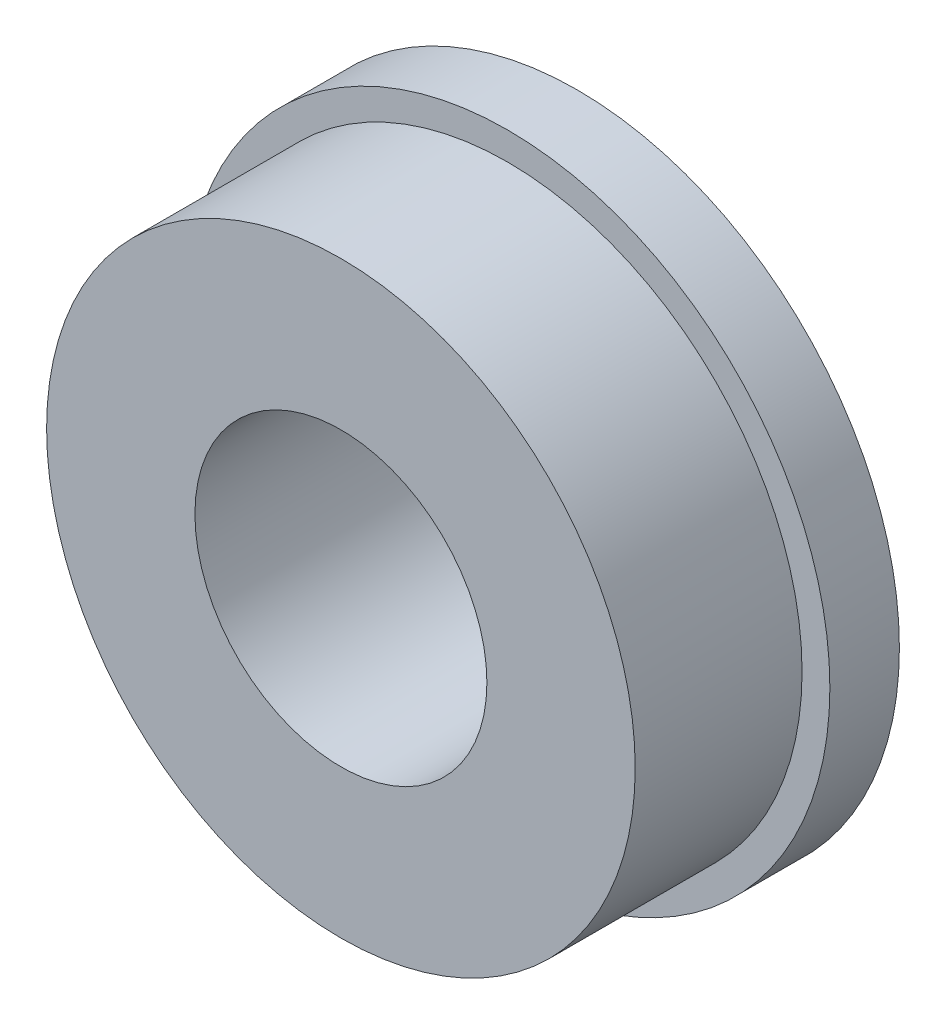
ISO-10303-21;
HEADER;
FILE_DESCRIPTION(('STEP AP214'),'2;1');
FILE_NAME('part.step','',(''),(''),'','','');
FILE_SCHEMA(('AUTOMOTIVE_DESIGN { 1 0 10303 214 1 1 1 1 }'));
ENDSEC;
DATA;
#1=APPLICATION_CONTEXT('core data for automotive mechanical design processes');
#2=APPLICATION_PROTOCOL_DEFINITION('international standard','automotive_design',2000,#1);
#3=PRODUCT_CONTEXT('',#1,'mechanical');
#4=PRODUCT('Part','Part','',(#3));
#5=PRODUCT_RELATED_PRODUCT_CATEGORY('part','',(#4));
#6=PRODUCT_DEFINITION_FORMATION('','',#4);
#7=PRODUCT_DEFINITION_CONTEXT('part definition',#1,'design');
#8=PRODUCT_DEFINITION('design','',#6,#7);
#9=PRODUCT_DEFINITION_SHAPE('','',#8);
#10=(LENGTH_UNIT() NAMED_UNIT(*) SI_UNIT(.MILLI.,.METRE.));
#11=(NAMED_UNIT(*) PLANE_ANGLE_UNIT() SI_UNIT($,.RADIAN.));
#12=(NAMED_UNIT(*) SI_UNIT($,.STERADIAN.) SOLID_ANGLE_UNIT());
#13=UNCERTAINTY_MEASURE_WITH_UNIT(LENGTH_MEASURE(1.E-05),#10,'distance_accuracy_value','');
#14=(GEOMETRIC_REPRESENTATION_CONTEXT(3) GLOBAL_UNCERTAINTY_ASSIGNED_CONTEXT((#13)) GLOBAL_UNIT_ASSIGNED_CONTEXT((#10,
#11,#12)) REPRESENTATION_CONTEXT('',''));
#15=CARTESIAN_POINT('',(0.,0.,0.));
#16=DIRECTION('',(0.,0.,1.));
#17=DIRECTION('',(1.,0.,0.));
#18=AXIS2_PLACEMENT_3D('',#15,#16,#17);
#19=CARTESIAN_POINT('',(0.,0.,1.5));
#20=DIRECTION('',(0.,0.,1.));
#21=DIRECTION('',(1.,0.,0.));
#22=AXIS2_PLACEMENT_3D('',#19,#20,#21);
#23=PLANE('',#22);
#24=CARTESIAN_POINT('',(0.,0.,1.5));
#25=DIRECTION('',(0.,0.,1.));
#26=DIRECTION('',(1.,0.,0.));
#27=AXIS2_PLACEMENT_3D('',#24,#25,#26);
#28=CIRCLE('',#27,6.95);
#29=CARTESIAN_POINT('',(6.95,0.,1.5));
#30=VERTEX_POINT('',#29);
#31=EDGE_CURVE('E10',#30,#30,#28,.T.);
#32=ORIENTED_EDGE('',*,*,#31,.T.);
#33=EDGE_LOOP('',(#32));
#34=FACE_BOUND('',#33,.T.);
#35=CARTESIAN_POINT('',(0.,0.,1.5));
#36=DIRECTION('',(0.,0.,1.));
#37=DIRECTION('',(1.,0.,0.));
#38=AXIS2_PLACEMENT_3D('',#35,#36,#37);
#39=CIRCLE('',#38,6.35);
#40=CARTESIAN_POINT('',(6.35,0.,1.5));
#41=VERTEX_POINT('',#40);
#42=EDGE_CURVE('E44',#41,#41,#39,.T.);
#43=ORIENTED_EDGE('',*,*,#42,.F.);
#44=EDGE_LOOP('',(#43));
#45=FACE_BOUND('',#44,.T.);
#46=ADVANCED_FACE('F31',(#34,#45),#23,.T.);
#47=CARTESIAN_POINT('',(0.,0.,1.5));
#48=DIRECTION('',(0.,0.,-1.));
#49=DIRECTION('',(-1.,0.,0.));
#50=AXIS2_PLACEMENT_3D('',#47,#48,#49);
#51=CYLINDRICAL_SURFACE('',#50,6.95);
#52=ORIENTED_EDGE('',*,*,#31,.F.);
#53=EDGE_LOOP('',(#52));
#54=FACE_BOUND('',#53,.T.);
#55=CARTESIAN_POINT('',(0.,0.,0.));
#56=DIRECTION('',(0.,0.,1.));
#57=DIRECTION('',(1.,0.,0.));
#58=AXIS2_PLACEMENT_3D('',#55,#56,#57);
#59=CIRCLE('',#58,6.95);
#60=CARTESIAN_POINT('',(6.95,0.,0.));
#61=VERTEX_POINT('',#60);
#62=EDGE_CURVE('E35',#61,#61,#59,.T.);
#63=ORIENTED_EDGE('',*,*,#62,.T.);
#64=EDGE_LOOP('',(#63));
#65=FACE_BOUND('',#64,.T.);
#66=ADVANCED_FACE('F33',(#54,#65),#51,.T.);
#67=CARTESIAN_POINT('',(0.,0.,0.));
#68=DIRECTION('',(0.,0.,1.));
#69=DIRECTION('',(1.,0.,0.));
#70=AXIS2_PLACEMENT_3D('',#67,#68,#69);
#71=PLANE('',#70);
#72=CARTESIAN_POINT('',(0.,0.,0.));
#73=DIRECTION('',(0.,0.,1.));
#74=DIRECTION('',(1.,0.,0.));
#75=AXIS2_PLACEMENT_3D('',#72,#73,#74);
#76=CIRCLE('',#75,3.15);
#77=CARTESIAN_POINT('',(3.15,0.,0.));
#78=VERTEX_POINT('',#77);
#79=EDGE_CURVE('E47',#78,#78,#76,.T.);
#80=ORIENTED_EDGE('',*,*,#79,.T.);
#81=EDGE_LOOP('',(#80));
#82=FACE_BOUND('',#81,.T.);
#83=ORIENTED_EDGE('',*,*,#62,.F.);
#84=EDGE_LOOP('',(#83));
#85=FACE_BOUND('',#84,.T.);
#86=ADVANCED_FACE('F56',(#82,#85),#71,.F.);
#87=CARTESIAN_POINT('',(0.,0.,5.1));
#88=DIRECTION('',(0.,0.,-1.));
#89=DIRECTION('',(-1.,0.,0.));
#90=AXIS2_PLACEMENT_3D('',#87,#88,#89);
#91=CYLINDRICAL_SURFACE('',#90,6.35);
#92=CARTESIAN_POINT('',(0.,0.,5.1));
#93=DIRECTION('',(0.,0.,1.));
#94=DIRECTION('',(1.,0.,0.));
#95=AXIS2_PLACEMENT_3D('',#92,#93,#94);
#96=CIRCLE('',#95,6.35);
#97=CARTESIAN_POINT('',(6.35,0.,5.1));
#98=VERTEX_POINT('',#97);
#99=EDGE_CURVE('E42',#98,#98,#96,.T.);
#100=ORIENTED_EDGE('',*,*,#99,.F.);
#101=EDGE_LOOP('',(#100));
#102=FACE_BOUND('',#101,.T.);
#103=ORIENTED_EDGE('',*,*,#42,.T.);
#104=EDGE_LOOP('',(#103));
#105=FACE_BOUND('',#104,.T.);
#106=ADVANCED_FACE('F68',(#102,#105),#91,.T.);
#107=CARTESIAN_POINT('',(0.,0.,5.1));
#108=DIRECTION('',(0.,0.,1.));
#109=DIRECTION('',(1.,0.,0.));
#110=AXIS2_PLACEMENT_3D('',#107,#108,#109);
#111=PLANE('',#110);
#112=CARTESIAN_POINT('',(0.,0.,5.1));
#113=DIRECTION('',(0.,0.,1.));
#114=DIRECTION('',(1.,0.,0.));
#115=AXIS2_PLACEMENT_3D('',#112,#113,#114);
#116=CIRCLE('',#115,3.15);
#117=CARTESIAN_POINT('',(3.15,0.,5.1));
#118=VERTEX_POINT('',#117);
#119=EDGE_CURVE('E50',#118,#118,#116,.T.);
#120=ORIENTED_EDGE('',*,*,#119,.F.);
#121=EDGE_LOOP('',(#120));
#122=FACE_BOUND('',#121,.T.);
#123=ORIENTED_EDGE('',*,*,#99,.T.);
#124=EDGE_LOOP('',(#123));
#125=FACE_BOUND('',#124,.T.);
#126=ADVANCED_FACE('F62',(#122,#125),#111,.T.);
#127=CARTESIAN_POINT('',(0.,0.,0.));
#128=DIRECTION('',(0.,0.,1.));
#129=DIRECTION('',(1.,0.,0.));
#130=AXIS2_PLACEMENT_3D('',#127,#128,#129);
#131=CYLINDRICAL_SURFACE('',#130,3.15);
#132=ORIENTED_EDGE('',*,*,#79,.F.);
#133=EDGE_LOOP('',(#132));
#134=FACE_BOUND('',#133,.T.);
#135=ORIENTED_EDGE('',*,*,#119,.T.);
#136=EDGE_LOOP('',(#135));
#137=FACE_BOUND('',#136,.T.);
#138=ADVANCED_FACE('F59',(#134,#137),#131,.F.);
#139=CLOSED_SHELL('',(#46,#66,#86,#106,#126,#138));
#140=MANIFOLD_SOLID_BREP('B2',#139);
#141=ADVANCED_BREP_SHAPE_REPRESENTATION('',(#18,#140),#14);
#142=SHAPE_DEFINITION_REPRESENTATION(#9,#141);
ENDSEC;
END-ISO-10303-21;
